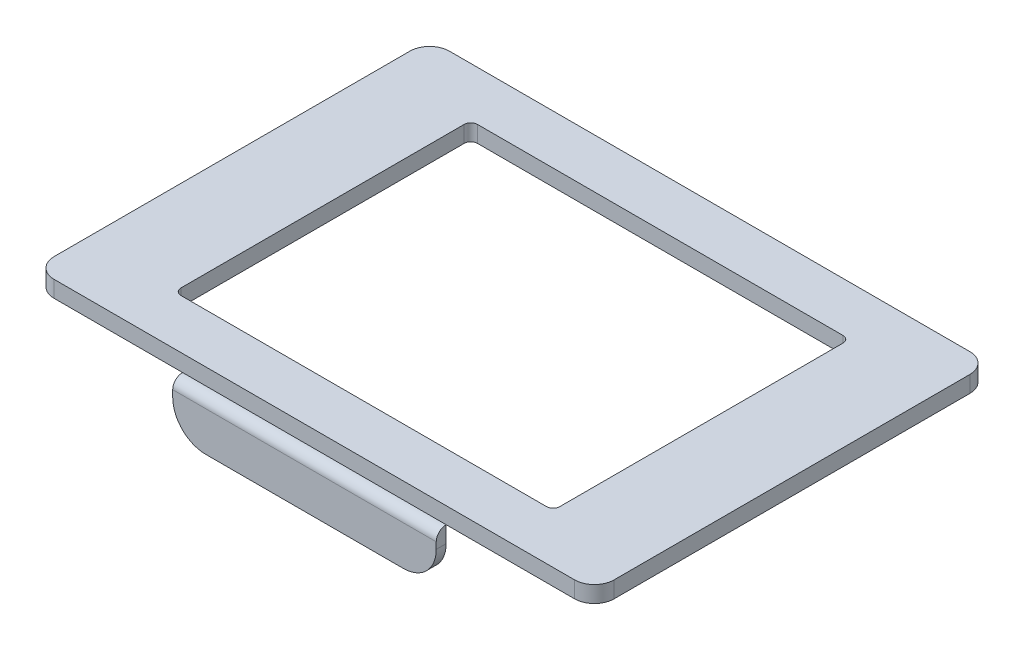
ISO-10303-21;
HEADER;
FILE_DESCRIPTION(('STEP AP214'),'2;1');
FILE_NAME('part.step','',(''),(''),'','','');
FILE_SCHEMA(('AUTOMOTIVE_DESIGN { 1 0 10303 214 1 1 1 1 }'));
ENDSEC;
DATA;
#1=APPLICATION_CONTEXT('core data for automotive mechanical design processes');
#2=APPLICATION_PROTOCOL_DEFINITION('international standard','automotive_design',2000,#1);
#3=PRODUCT_CONTEXT('',#1,'mechanical');
#4=PRODUCT('Part','Part','',(#3));
#5=PRODUCT_RELATED_PRODUCT_CATEGORY('part','',(#4));
#6=PRODUCT_DEFINITION_FORMATION('','',#4);
#7=PRODUCT_DEFINITION_CONTEXT('part definition',#1,'design');
#8=PRODUCT_DEFINITION('design','',#6,#7);
#9=PRODUCT_DEFINITION_SHAPE('','',#8);
#10=(LENGTH_UNIT() NAMED_UNIT(*) SI_UNIT(.MILLI.,.METRE.));
#11=(NAMED_UNIT(*) PLANE_ANGLE_UNIT() SI_UNIT($,.RADIAN.));
#12=(NAMED_UNIT(*) SI_UNIT($,.STERADIAN.) SOLID_ANGLE_UNIT());
#13=UNCERTAINTY_MEASURE_WITH_UNIT(LENGTH_MEASURE(1.E-05),#10,'distance_accuracy_value','');
#14=(GEOMETRIC_REPRESENTATION_CONTEXT(3) GLOBAL_UNCERTAINTY_ASSIGNED_CONTEXT((#13)) GLOBAL_UNIT_ASSIGNED_CONTEXT((#10,
#11,#12)) REPRESENTATION_CONTEXT('',''));
#15=CARTESIAN_POINT('',(0.,0.,0.));
#16=DIRECTION('',(0.,0.,1.));
#17=DIRECTION('',(1.,0.,0.));
#18=AXIS2_PLACEMENT_3D('',#15,#16,#17);
#19=CARTESIAN_POINT('',(40.,0.,-63.));
#20=DIRECTION('',(-1.,0.,0.));
#21=DIRECTION('',(0.,0.,1.));
#22=AXIS2_PLACEMENT_3D('',#19,#20,#21);
#23=PLANE('',#22);
#24=DIRECTION('',(0.,-1.,0.));
#25=VECTOR('',#24,1.);
#26=CARTESIAN_POINT('',(40.,0.,-60.));
#27=LINE('',#26,#25);
#28=CARTESIAN_POINT('',(40.,0.,-60.));
#29=VERTEX_POINT('',#28);
#30=CARTESIAN_POINT('',(40.,-5.,-60.));
#31=VERTEX_POINT('',#30);
#32=EDGE_CURVE('E119',#29,#31,#27,.T.);
#33=ORIENTED_EDGE('',*,*,#32,.T.);
#34=DIRECTION('',(0.,0.,1.));
#35=VECTOR('',#34,1.);
#36=CARTESIAN_POINT('',(40.,-5.,-63.));
#37=LINE('',#36,#35);
#38=CARTESIAN_POINT('',(40.,-5.,-63.));
#39=VERTEX_POINT('',#38);
#40=EDGE_CURVE('E71',#31,#39,#37,.F.);
#41=ORIENTED_EDGE('',*,*,#40,.T.);
#42=DIRECTION('',(0.,-1.,0.));
#43=VECTOR('',#42,1.);
#44=CARTESIAN_POINT('',(40.,0.,-63.));
#45=LINE('',#44,#43);
#46=CARTESIAN_POINT('',(40.,-3.,-63.));
#47=VERTEX_POINT('',#46);
#48=EDGE_CURVE('E121',#47,#39,#45,.T.);
#49=ORIENTED_EDGE('',*,*,#48,.F.);
#50=CARTESIAN_POINT('',(40.,-3.,-60.));
#51=DIRECTION('',(-1.,0.,0.));
#52=DIRECTION('',(0.,0.,1.));
#53=AXIS2_PLACEMENT_3D('',#50,#51,#52);
#54=CIRCLE('',#53,3.);
#55=EDGE_CURVE('E127',#47,#29,#54,.F.);
#56=ORIENTED_EDGE('',*,*,#55,.T.);
#57=EDGE_LOOP('',(#33,#41,#49,#56));
#58=FACE_BOUND('',#57,.T.);
#59=ADVANCED_FACE('F48',(#58),#23,.F.);
#60=CARTESIAN_POINT('',(40.,-15.,-63.));
#61=DIRECTION('',(0.,1.,0.));
#62=DIRECTION('',(0.,0.,1.));
#63=AXIS2_PLACEMENT_3D('',#60,#61,#62);
#64=PLANE('',#63);
#65=DIRECTION('',(-1.,0.,0.));
#66=VECTOR('',#65,1.);
#67=CARTESIAN_POINT('',(40.,-15.,-63.));
#68=LINE('',#67,#66);
#69=CARTESIAN_POINT('',(30.,-15.,-63.));
#70=VERTEX_POINT('',#69);
#71=CARTESIAN_POINT('',(-30.,-15.,-63.));
#72=VERTEX_POINT('',#71);
#73=EDGE_CURVE('E144',#70,#72,#68,.T.);
#74=ORIENTED_EDGE('',*,*,#73,.F.);
#75=DIRECTION('',(0.,0.,1.));
#76=VECTOR('',#75,1.);
#77=CARTESIAN_POINT('',(30.,-15.,-63.));
#78=LINE('',#77,#76);
#79=CARTESIAN_POINT('',(30.,-15.,-60.));
#80=VERTEX_POINT('',#79);
#81=EDGE_CURVE('E129',#70,#80,#78,.T.);
#82=ORIENTED_EDGE('',*,*,#81,.T.);
#83=DIRECTION('',(-1.,0.,0.));
#84=VECTOR('',#83,1.);
#85=CARTESIAN_POINT('',(40.,-15.,-60.));
#86=LINE('',#85,#84);
#87=CARTESIAN_POINT('',(-30.,-15.,-60.));
#88=VERTEX_POINT('',#87);
#89=EDGE_CURVE('E113',#80,#88,#86,.T.);
#90=ORIENTED_EDGE('',*,*,#89,.T.);
#91=DIRECTION('',(0.,0.,1.));
#92=VECTOR('',#91,1.);
#93=CARTESIAN_POINT('',(-30.,-15.,-63.));
#94=LINE('',#93,#92);
#95=EDGE_CURVE('E126',#88,#72,#94,.F.);
#96=ORIENTED_EDGE('',*,*,#95,.T.);
#97=EDGE_LOOP('',(#74,#82,#90,#96));
#98=FACE_BOUND('',#97,.T.);
#99=ADVANCED_FACE('F148',(#98),#64,.F.);
#100=CARTESIAN_POINT('',(-40.,0.,-63.));
#101=DIRECTION('',(1.,0.,0.));
#102=DIRECTION('',(0.,0.,-1.));
#103=AXIS2_PLACEMENT_3D('',#100,#101,#102);
#104=PLANE('',#103);
#105=DIRECTION('',(0.,1.,0.));
#106=VECTOR('',#105,1.);
#107=CARTESIAN_POINT('',(-40.,0.,-63.));
#108=LINE('',#107,#106);
#109=CARTESIAN_POINT('',(-40.,-5.,-63.));
#110=VERTEX_POINT('',#109);
#111=CARTESIAN_POINT('',(-40.,-3.,-63.));
#112=VERTEX_POINT('',#111);
#113=EDGE_CURVE('E151',#110,#112,#108,.T.);
#114=ORIENTED_EDGE('',*,*,#113,.F.);
#115=DIRECTION('',(0.,0.,1.));
#116=VECTOR('',#115,1.);
#117=CARTESIAN_POINT('',(-40.,-5.,-63.));
#118=LINE('',#117,#116);
#119=CARTESIAN_POINT('',(-40.,-5.,-60.));
#120=VERTEX_POINT('',#119);
#121=EDGE_CURVE('E12',#110,#120,#118,.T.);
#122=ORIENTED_EDGE('',*,*,#121,.T.);
#123=DIRECTION('',(0.,1.,0.));
#124=VECTOR('',#123,1.);
#125=CARTESIAN_POINT('',(-40.,0.,-60.));
#126=LINE('',#125,#124);
#127=CARTESIAN_POINT('',(-40.,0.,-60.));
#128=VERTEX_POINT('',#127);
#129=EDGE_CURVE('E104',#120,#128,#126,.T.);
#130=ORIENTED_EDGE('',*,*,#129,.T.);
#131=CARTESIAN_POINT('',(-40.,-3.,-60.));
#132=DIRECTION('',(1.,0.,0.));
#133=DIRECTION('',(0.,0.,-1.));
#134=AXIS2_PLACEMENT_3D('',#131,#132,#133);
#135=CIRCLE('',#134,3.);
#136=EDGE_CURVE('E108',#128,#112,#135,.F.);
#137=ORIENTED_EDGE('',*,*,#136,.T.);
#138=EDGE_LOOP('',(#114,#122,#130,#137));
#139=FACE_BOUND('',#138,.T.);
#140=ADVANCED_FACE('F106',(#139),#104,.F.);
#141=CARTESIAN_POINT('',(0.,0.,-63.));
#142=DIRECTION('',(0.,0.,-1.));
#143=DIRECTION('',(-1.,0.,0.));
#144=AXIS2_PLACEMENT_3D('',#141,#142,#143);
#145=PLANE('',#144);
#146=ORIENTED_EDGE('',*,*,#48,.T.);
#147=CARTESIAN_POINT('',(30.,-5.,-63.));
#148=DIRECTION('',(0.,0.,-1.));
#149=DIRECTION('',(-1.,0.,0.));
#150=AXIS2_PLACEMENT_3D('',#147,#148,#149);
#151=CIRCLE('',#150,10.);
#152=EDGE_CURVE('E56',#39,#70,#151,.T.);
#153=ORIENTED_EDGE('',*,*,#152,.T.);
#154=ORIENTED_EDGE('',*,*,#73,.T.);
#155=CARTESIAN_POINT('',(-30.,-5.,-63.));
#156=DIRECTION('',(0.,0.,-1.));
#157=DIRECTION('',(-1.,0.,0.));
#158=AXIS2_PLACEMENT_3D('',#155,#156,#157);
#159=CIRCLE('',#158,10.);
#160=EDGE_CURVE('E63',#72,#110,#159,.T.);
#161=ORIENTED_EDGE('',*,*,#160,.T.);
#162=ORIENTED_EDGE('',*,*,#113,.T.);
#163=DIRECTION('',(1.,0.,0.));
#164=VECTOR('',#163,1.);
#165=CARTESIAN_POINT('',(40.,-3.,-63.));
#166=LINE('',#165,#164);
#167=EDGE_CURVE('E125',#112,#47,#166,.T.);
#168=ORIENTED_EDGE('',*,*,#167,.T.);
#169=EDGE_LOOP('',(#146,#153,#154,#161,#162,#168));
#170=FACE_BOUND('',#169,.T.);
#171=ADVANCED_FACE('F143',(#170),#145,.T.);
#172=CARTESIAN_POINT('',(0.,0.,-60.));
#173=DIRECTION('',(0.,0.,-1.));
#174=DIRECTION('',(-1.,0.,0.));
#175=AXIS2_PLACEMENT_3D('',#172,#173,#174);
#176=PLANE('',#175);
#177=ORIENTED_EDGE('',*,*,#89,.F.);
#178=CARTESIAN_POINT('',(30.,-5.,-60.));
#179=DIRECTION('',(0.,0.,-1.));
#180=DIRECTION('',(-1.,0.,0.));
#181=AXIS2_PLACEMENT_3D('',#178,#179,#180);
#182=CIRCLE('',#181,10.);
#183=EDGE_CURVE('E138',#80,#31,#182,.F.);
#184=ORIENTED_EDGE('',*,*,#183,.T.);
#185=ORIENTED_EDGE('',*,*,#32,.F.);
#186=DIRECTION('',(1.,0.,0.));
#187=VECTOR('',#186,1.);
#188=CARTESIAN_POINT('',(40.,0.,-60.));
#189=LINE('',#188,#187);
#190=EDGE_CURVE('E112',#128,#29,#189,.T.);
#191=ORIENTED_EDGE('',*,*,#190,.F.);
#192=ORIENTED_EDGE('',*,*,#129,.F.);
#193=CARTESIAN_POINT('',(-30.,-5.,-60.));
#194=DIRECTION('',(0.,0.,-1.));
#195=DIRECTION('',(-1.,0.,0.));
#196=AXIS2_PLACEMENT_3D('',#193,#194,#195);
#197=CIRCLE('',#196,10.);
#198=EDGE_CURVE('E136',#120,#88,#197,.F.);
#199=ORIENTED_EDGE('',*,*,#198,.T.);
#200=EDGE_LOOP('',(#177,#184,#185,#191,#192,#199));
#201=FACE_BOUND('',#200,.T.);
#202=ADVANCED_FACE('F118',(#201),#176,.F.);
#203=CARTESIAN_POINT('',(0.,-3.,-60.));
#204=DIRECTION('',(-1.,0.,0.));
#205=DIRECTION('',(0.,-1.,0.));
#206=AXIS2_PLACEMENT_3D('',#203,#204,#205);
#207=CYLINDRICAL_SURFACE('',#206,3.);
#208=ORIENTED_EDGE('',*,*,#136,.F.);
#209=ORIENTED_EDGE('',*,*,#190,.T.);
#210=ORIENTED_EDGE('',*,*,#55,.F.);
#211=ORIENTED_EDGE('',*,*,#167,.F.);
#212=EDGE_LOOP('',(#208,#209,#210,#211));
#213=FACE_BOUND('',#212,.T.);
#214=ADVANCED_FACE('F123',(#213),#207,.T.);
#215=CARTESIAN_POINT('',(30.,-5.,-63.));
#216=DIRECTION('',(0.,0.,1.));
#217=DIRECTION('',(1.,0.,0.));
#218=AXIS2_PLACEMENT_3D('',#215,#216,#217);
#219=CYLINDRICAL_SURFACE('',#218,10.);
#220=ORIENTED_EDGE('',*,*,#152,.F.);
#221=ORIENTED_EDGE('',*,*,#40,.F.);
#222=ORIENTED_EDGE('',*,*,#183,.F.);
#223=ORIENTED_EDGE('',*,*,#81,.F.);
#224=EDGE_LOOP('',(#220,#221,#222,#223));
#225=FACE_BOUND('',#224,.T.);
#226=ADVANCED_FACE('F153',(#225),#219,.T.);
#227=CARTESIAN_POINT('',(-30.,-5.,-63.));
#228=DIRECTION('',(0.,0.,1.));
#229=DIRECTION('',(1.,0.,0.));
#230=AXIS2_PLACEMENT_3D('',#227,#228,#229);
#231=CYLINDRICAL_SURFACE('',#230,10.);
#232=ORIENTED_EDGE('',*,*,#160,.F.);
#233=ORIENTED_EDGE('',*,*,#95,.F.);
#234=ORIENTED_EDGE('',*,*,#198,.F.);
#235=ORIENTED_EDGE('',*,*,#121,.F.);
#236=EDGE_LOOP('',(#232,#233,#234,#235));
#237=FACE_BOUND('',#236,.T.);
#238=ADVANCED_FACE('F50',(#237),#231,.T.);
#239=CLOSED_SHELL('',(#59,#99,#140,#171,#202,#214,#226,#238));
#240=MANIFOLD_SOLID_BREP('B2',#239);
#241=CARTESIAN_POINT('',(-40.,0.,63.));
#242=DIRECTION('',(1.,0.,0.));
#243=DIRECTION('',(0.,1.,0.));
#244=AXIS2_PLACEMENT_3D('',#241,#242,#243);
#245=PLANE('',#244);
#246=DIRECTION('',(0.,-1.,0.));
#247=VECTOR('',#246,1.);
#248=CARTESIAN_POINT('',(-40.,0.,63.));
#249=LINE('',#248,#247);
#250=CARTESIAN_POINT('',(-40.,-3.00000000000001,63.));
#251=VERTEX_POINT('',#250);
#252=CARTESIAN_POINT('',(-40.,-5.,63.));
#253=VERTEX_POINT('',#252);
#254=EDGE_CURVE('E297',#251,#253,#249,.T.);
#255=ORIENTED_EDGE('',*,*,#254,.F.);
#256=CARTESIAN_POINT('',(-40.,-3.00000000000001,60.));
#257=DIRECTION('',(1.,0.,0.));
#258=DIRECTION('',(0.,1.,0.));
#259=AXIS2_PLACEMENT_3D('',#256,#257,#258);
#260=CIRCLE('',#259,3.);
#261=CARTESIAN_POINT('',(-40.,0.,60.));
#262=VERTEX_POINT('',#261);
#263=EDGE_CURVE('E241',#251,#262,#260,.F.);
#264=ORIENTED_EDGE('',*,*,#263,.T.);
#265=DIRECTION('',(0.,-1.,0.));
#266=VECTOR('',#265,1.);
#267=CARTESIAN_POINT('',(-40.,0.,60.));
#268=LINE('',#267,#266);
#269=CARTESIAN_POINT('',(-40.,-5.,60.));
#270=VERTEX_POINT('',#269);
#271=EDGE_CURVE('E296',#262,#270,#268,.T.);
#272=ORIENTED_EDGE('',*,*,#271,.T.);
#273=DIRECTION('',(0.,0.,-1.));
#274=VECTOR('',#273,1.);
#275=CARTESIAN_POINT('',(-40.,-5.,63.));
#276=LINE('',#275,#274);
#277=EDGE_CURVE('E302',#270,#253,#276,.F.);
#278=ORIENTED_EDGE('',*,*,#277,.T.);
#279=EDGE_LOOP('',(#255,#264,#272,#278));
#280=FACE_BOUND('',#279,.T.);
#281=ADVANCED_FACE('F233',(#280),#245,.F.);
#282=CARTESIAN_POINT('',(-40.,-15.,63.));
#283=DIRECTION('',(0.,1.,0.));
#284=DIRECTION('',(-1.,0.,0.));
#285=AXIS2_PLACEMENT_3D('',#282,#283,#284);
#286=PLANE('',#285);
#287=DIRECTION('',(1.,0.,0.));
#288=VECTOR('',#287,1.);
#289=CARTESIAN_POINT('',(-40.,-15.,60.));
#290=LINE('',#289,#288);
#291=CARTESIAN_POINT('',(-30.,-15.,60.));
#292=VERTEX_POINT('',#291);
#293=CARTESIAN_POINT('',(30.,-15.,60.));
#294=VERTEX_POINT('',#293);
#295=EDGE_CURVE('E291',#292,#294,#290,.T.);
#296=ORIENTED_EDGE('',*,*,#295,.T.);
#297=DIRECTION('',(0.,0.,-1.));
#298=VECTOR('',#297,1.);
#299=CARTESIAN_POINT('',(30.,-15.,63.));
#300=LINE('',#299,#298);
#301=CARTESIAN_POINT('',(30.,-15.,63.));
#302=VERTEX_POINT('',#301);
#303=EDGE_CURVE('E311',#294,#302,#300,.F.);
#304=ORIENTED_EDGE('',*,*,#303,.T.);
#305=DIRECTION('',(1.,0.,0.));
#306=VECTOR('',#305,1.);
#307=CARTESIAN_POINT('',(-40.,-15.,63.));
#308=LINE('',#307,#306);
#309=CARTESIAN_POINT('',(-30.,-15.,63.));
#310=VERTEX_POINT('',#309);
#311=EDGE_CURVE('E326',#310,#302,#308,.T.);
#312=ORIENTED_EDGE('',*,*,#311,.F.);
#313=DIRECTION('',(0.,0.,-1.));
#314=VECTOR('',#313,1.);
#315=CARTESIAN_POINT('',(-30.,-15.,63.));
#316=LINE('',#315,#314);
#317=EDGE_CURVE('E313',#310,#292,#316,.T.);
#318=ORIENTED_EDGE('',*,*,#317,.T.);
#319=EDGE_LOOP('',(#296,#304,#312,#318));
#320=FACE_BOUND('',#319,.T.);
#321=ADVANCED_FACE('F339',(#320),#286,.F.);
#322=CARTESIAN_POINT('',(40.,0.,63.));
#323=DIRECTION('',(-1.,0.,0.));
#324=DIRECTION('',(0.,0.,1.));
#325=AXIS2_PLACEMENT_3D('',#322,#323,#324);
#326=PLANE('',#325);
#327=DIRECTION('',(0.,1.,0.));
#328=VECTOR('',#327,1.);
#329=CARTESIAN_POINT('',(40.,0.,60.));
#330=LINE('',#329,#328);
#331=CARTESIAN_POINT('',(40.,-5.,60.));
#332=VERTEX_POINT('',#331);
#333=CARTESIAN_POINT('',(40.,0.,60.));
#334=VERTEX_POINT('',#333);
#335=EDGE_CURVE('E284',#332,#334,#330,.T.);
#336=ORIENTED_EDGE('',*,*,#335,.T.);
#337=CARTESIAN_POINT('',(40.,-3.,60.));
#338=DIRECTION('',(-1.,0.,0.));
#339=DIRECTION('',(0.,0.,1.));
#340=AXIS2_PLACEMENT_3D('',#337,#338,#339);
#341=CIRCLE('',#340,3.);
#342=CARTESIAN_POINT('',(40.,-3.,63.));
#343=VERTEX_POINT('',#342);
#344=EDGE_CURVE('E46',#334,#343,#341,.F.);
#345=ORIENTED_EDGE('',*,*,#344,.T.);
#346=DIRECTION('',(0.,1.,0.));
#347=VECTOR('',#346,1.);
#348=CARTESIAN_POINT('',(40.,0.,63.));
#349=LINE('',#348,#347);
#350=CARTESIAN_POINT('',(40.,-5.,63.));
#351=VERTEX_POINT('',#350);
#352=EDGE_CURVE('E320',#351,#343,#349,.T.);
#353=ORIENTED_EDGE('',*,*,#352,.F.);
#354=DIRECTION('',(0.,0.,-1.));
#355=VECTOR('',#354,1.);
#356=CARTESIAN_POINT('',(40.,-5.,63.));
#357=LINE('',#356,#355);
#358=EDGE_CURVE('E288',#351,#332,#357,.T.);
#359=ORIENTED_EDGE('',*,*,#358,.T.);
#360=EDGE_LOOP('',(#336,#345,#353,#359));
#361=FACE_BOUND('',#360,.T.);
#362=ADVANCED_FACE('F286',(#361),#326,.F.);
#363=CARTESIAN_POINT('',(0.,0.,63.));
#364=DIRECTION('',(0.,0.,1.));
#365=DIRECTION('',(1.,0.,0.));
#366=AXIS2_PLACEMENT_3D('',#363,#364,#365);
#367=PLANE('',#366);
#368=ORIENTED_EDGE('',*,*,#352,.T.);
#369=DIRECTION('',(-1.,0.,0.));
#370=VECTOR('',#369,1.);
#371=CARTESIAN_POINT('',(-40.,-3.00000000000001,63.));
#372=LINE('',#371,#370);
#373=EDGE_CURVE('E299',#343,#251,#372,.T.);
#374=ORIENTED_EDGE('',*,*,#373,.T.);
#375=ORIENTED_EDGE('',*,*,#254,.T.);
#376=CARTESIAN_POINT('',(-30.,-5.00000000000001,63.));
#377=DIRECTION('',(0.,0.,1.));
#378=DIRECTION('',(1.,0.,0.));
#379=AXIS2_PLACEMENT_3D('',#376,#377,#378);
#380=CIRCLE('',#379,10.);
#381=EDGE_CURVE('E309',#253,#310,#380,.T.);
#382=ORIENTED_EDGE('',*,*,#381,.T.);
#383=ORIENTED_EDGE('',*,*,#311,.T.);
#384=CARTESIAN_POINT('',(30.,-5.,63.));
#385=DIRECTION('',(0.,0.,1.));
#386=DIRECTION('',(1.,0.,0.));
#387=AXIS2_PLACEMENT_3D('',#384,#385,#386);
#388=CIRCLE('',#387,10.);
#389=EDGE_CURVE('E305',#302,#351,#388,.T.);
#390=ORIENTED_EDGE('',*,*,#389,.T.);
#391=EDGE_LOOP('',(#368,#374,#375,#382,#383,#390));
#392=FACE_BOUND('',#391,.T.);
#393=ADVANCED_FACE('F329',(#392),#367,.T.);
#394=CARTESIAN_POINT('',(0.,0.,60.));
#395=DIRECTION('',(0.,0.,1.));
#396=DIRECTION('',(1.,0.,0.));
#397=AXIS2_PLACEMENT_3D('',#394,#395,#396);
#398=PLANE('',#397);
#399=ORIENTED_EDGE('',*,*,#335,.F.);
#400=CARTESIAN_POINT('',(30.,-5.,60.));
#401=DIRECTION('',(0.,0.,1.));
#402=DIRECTION('',(1.,0.,0.));
#403=AXIS2_PLACEMENT_3D('',#400,#401,#402);
#404=CIRCLE('',#403,10.);
#405=EDGE_CURVE('E316',#332,#294,#404,.F.);
#406=ORIENTED_EDGE('',*,*,#405,.T.);
#407=ORIENTED_EDGE('',*,*,#295,.F.);
#408=CARTESIAN_POINT('',(-30.,-5.00000000000001,60.));
#409=DIRECTION('',(0.,0.,1.));
#410=DIRECTION('',(1.,0.,0.));
#411=AXIS2_PLACEMENT_3D('',#408,#409,#410);
#412=CIRCLE('',#411,10.);
#413=EDGE_CURVE('E318',#292,#270,#412,.F.);
#414=ORIENTED_EDGE('',*,*,#413,.T.);
#415=ORIENTED_EDGE('',*,*,#271,.F.);
#416=DIRECTION('',(-1.,0.,0.));
#417=VECTOR('',#416,1.);
#418=CARTESIAN_POINT('',(-40.,0.,60.));
#419=LINE('',#418,#417);
#420=EDGE_CURVE('E290',#334,#262,#419,.T.);
#421=ORIENTED_EDGE('',*,*,#420,.F.);
#422=EDGE_LOOP('',(#399,#406,#407,#414,#415,#421));
#423=FACE_BOUND('',#422,.T.);
#424=ADVANCED_FACE('F294',(#423),#398,.F.);
#425=CARTESIAN_POINT('',(30.,-5.,63.));
#426=DIRECTION('',(0.,0.,-1.));
#427=DIRECTION('',(-1.,0.,0.));
#428=AXIS2_PLACEMENT_3D('',#425,#426,#427);
#429=CYLINDRICAL_SURFACE('',#428,10.);
#430=ORIENTED_EDGE('',*,*,#389,.F.);
#431=ORIENTED_EDGE('',*,*,#303,.F.);
#432=ORIENTED_EDGE('',*,*,#405,.F.);
#433=ORIENTED_EDGE('',*,*,#358,.F.);
#434=EDGE_LOOP('',(#430,#431,#432,#433));
#435=FACE_BOUND('',#434,.T.);
#436=ADVANCED_FACE('F343',(#435),#429,.T.);
#437=CARTESIAN_POINT('',(-30.,-5.00000000000001,63.));
#438=DIRECTION('',(0.,0.,-1.));
#439=DIRECTION('',(-1.,0.,0.));
#440=AXIS2_PLACEMENT_3D('',#437,#438,#439);
#441=CYLINDRICAL_SURFACE('',#440,10.);
#442=ORIENTED_EDGE('',*,*,#381,.F.);
#443=ORIENTED_EDGE('',*,*,#277,.F.);
#444=ORIENTED_EDGE('',*,*,#413,.F.);
#445=ORIENTED_EDGE('',*,*,#317,.F.);
#446=EDGE_LOOP('',(#442,#443,#444,#445));
#447=FACE_BOUND('',#446,.T.);
#448=ADVANCED_FACE('F336',(#447),#441,.T.);
#449=CARTESIAN_POINT('',(0.,-3.00000000000001,60.));
#450=DIRECTION('',(1.,0.,0.));
#451=DIRECTION('',(0.,1.,0.));
#452=AXIS2_PLACEMENT_3D('',#449,#450,#451);
#453=CYLINDRICAL_SURFACE('',#452,3.);
#454=ORIENTED_EDGE('',*,*,#344,.F.);
#455=ORIENTED_EDGE('',*,*,#420,.T.);
#456=ORIENTED_EDGE('',*,*,#263,.F.);
#457=ORIENTED_EDGE('',*,*,#373,.F.);
#458=EDGE_LOOP('',(#454,#455,#456,#457));
#459=FACE_BOUND('',#458,.T.);
#460=ADVANCED_FACE('F235',(#459),#453,.T.);
#461=CLOSED_SHELL('',(#281,#321,#362,#393,#424,#436,#448,#460));
#462=MANIFOLD_SOLID_BREP('B6',#461);
#463=CARTESIAN_POINT('',(85.,5.,-60.));
#464=DIRECTION('',(-1.,0.,0.));
#465=DIRECTION('',(0.,0.,1.));
#466=AXIS2_PLACEMENT_3D('',#463,#464,#465);
#467=PLANE('',#466);
#468=DIRECTION('',(0.,0.,-1.));
#469=VECTOR('',#468,1.);
#470=CARTESIAN_POINT('',(85.,0.,-60.));
#471=LINE('',#470,#469);
#472=CARTESIAN_POINT('',(85.,0.,54.));
#473=VERTEX_POINT('',#472);
#474=CARTESIAN_POINT('',(85.,0.,-54.));
#475=VERTEX_POINT('',#474);
#476=EDGE_CURVE('E550',#473,#475,#471,.T.);
#477=ORIENTED_EDGE('',*,*,#476,.T.);
#478=DIRECTION('',(0.,-1.,0.));
#479=VECTOR('',#478,1.);
#480=CARTESIAN_POINT('',(85.,5.,-54.));
#481=LINE('',#480,#479);
#482=CARTESIAN_POINT('',(85.,5.,-54.));
#483=VERTEX_POINT('',#482);
#484=EDGE_CURVE('E528',#475,#483,#481,.F.);
#485=ORIENTED_EDGE('',*,*,#484,.T.);
#486=DIRECTION('',(0.,0.,-1.));
#487=VECTOR('',#486,1.);
#488=CARTESIAN_POINT('',(85.,5.,-60.));
#489=LINE('',#488,#487);
#490=CARTESIAN_POINT('',(85.,5.,54.));
#491=VERTEX_POINT('',#490);
#492=EDGE_CURVE('E561',#491,#483,#489,.T.);
#493=ORIENTED_EDGE('',*,*,#492,.F.);
#494=DIRECTION('',(0.,-1.,0.));
#495=VECTOR('',#494,1.);
#496=CARTESIAN_POINT('',(85.,5.,54.));
#497=LINE('',#496,#495);
#498=EDGE_CURVE('E533',#491,#473,#497,.T.);
#499=ORIENTED_EDGE('',*,*,#498,.T.);
#500=EDGE_LOOP('',(#477,#485,#493,#499));
#501=FACE_BOUND('',#500,.T.);
#502=ADVANCED_FACE('F409',(#501),#467,.F.);
#503=CARTESIAN_POINT('',(-85.,5.,-60.));
#504=DIRECTION('',(0.,0.,1.));
#505=DIRECTION('',(1.,0.,0.));
#506=AXIS2_PLACEMENT_3D('',#503,#504,#505);
#507=PLANE('',#506);
#508=DIRECTION('',(-1.,0.,0.));
#509=VECTOR('',#508,1.);
#510=CARTESIAN_POINT('',(-85.,5.,-60.));
#511=LINE('',#510,#509);
#512=CARTESIAN_POINT('',(79.,5.,-60.));
#513=VERTEX_POINT('',#512);
#514=CARTESIAN_POINT('',(-79.,5.,-60.));
#515=VERTEX_POINT('',#514);
#516=EDGE_CURVE('E542',#513,#515,#511,.T.);
#517=ORIENTED_EDGE('',*,*,#516,.F.);
#518=DIRECTION('',(0.,-1.,0.));
#519=VECTOR('',#518,1.);
#520=CARTESIAN_POINT('',(79.,5.,-60.));
#521=LINE('',#520,#519);
#522=CARTESIAN_POINT('',(79.,0.,-60.));
#523=VERTEX_POINT('',#522);
#524=EDGE_CURVE('E527',#513,#523,#521,.T.);
#525=ORIENTED_EDGE('',*,*,#524,.T.);
#526=DIRECTION('',(-1.,0.,0.));
#527=VECTOR('',#526,1.);
#528=CARTESIAN_POINT('',(-85.,0.,-60.));
#529=LINE('',#528,#527);
#530=CARTESIAN_POINT('',(-79.,0.,-60.));
#531=VERTEX_POINT('',#530);
#532=EDGE_CURVE('E539',#523,#531,#529,.T.);
#533=ORIENTED_EDGE('',*,*,#532,.T.);
#534=DIRECTION('',(0.,-1.,0.));
#535=VECTOR('',#534,1.);
#536=CARTESIAN_POINT('',(-79.,5.,-60.));
#537=LINE('',#536,#535);
#538=EDGE_CURVE('E544',#531,#515,#537,.F.);
#539=ORIENTED_EDGE('',*,*,#538,.T.);
#540=EDGE_LOOP('',(#517,#525,#533,#539));
#541=FACE_BOUND('',#540,.T.);
#542=ADVANCED_FACE('F538',(#541),#507,.F.);
#543=CARTESIAN_POINT('',(-85.,5.,-60.));
#544=DIRECTION('',(1.,0.,0.));
#545=DIRECTION('',(0.,0.,-1.));
#546=AXIS2_PLACEMENT_3D('',#543,#544,#545);
#547=PLANE('',#546);
#548=DIRECTION('',(0.,0.,1.));
#549=VECTOR('',#548,1.);
#550=CARTESIAN_POINT('',(-85.,5.,-60.));
#551=LINE('',#550,#549);
#552=CARTESIAN_POINT('',(-85.,5.,-54.));
#553=VERTEX_POINT('',#552);
#554=CARTESIAN_POINT('',(-85.,5.,54.));
#555=VERTEX_POINT('',#554);
#556=EDGE_CURVE('E676',#553,#555,#551,.T.);
#557=ORIENTED_EDGE('',*,*,#556,.F.);
#558=DIRECTION('',(0.,-1.,0.));
#559=VECTOR('',#558,1.);
#560=CARTESIAN_POINT('',(-85.,5.,-54.));
#561=LINE('',#560,#559);
#562=CARTESIAN_POINT('',(-85.,0.,-54.));
#563=VERTEX_POINT('',#562);
#564=EDGE_CURVE('E581',#553,#563,#561,.T.);
#565=ORIENTED_EDGE('',*,*,#564,.T.);
#566=DIRECTION('',(0.,0.,1.));
#567=VECTOR('',#566,1.);
#568=CARTESIAN_POINT('',(-85.,0.,-60.));
#569=LINE('',#568,#567);
#570=CARTESIAN_POINT('',(-85.,0.,54.));
#571=VERTEX_POINT('',#570);
#572=EDGE_CURVE('E549',#563,#571,#569,.T.);
#573=ORIENTED_EDGE('',*,*,#572,.T.);
#574=DIRECTION('',(0.,-1.,0.));
#575=VECTOR('',#574,1.);
#576=CARTESIAN_POINT('',(-85.,5.,54.));
#577=LINE('',#576,#575);
#578=EDGE_CURVE('E579',#571,#555,#577,.F.);
#579=ORIENTED_EDGE('',*,*,#578,.T.);
#580=EDGE_LOOP('',(#557,#565,#573,#579));
#581=FACE_BOUND('',#580,.T.);
#582=ADVANCED_FACE('F697',(#581),#547,.F.);
#583=CARTESIAN_POINT('',(-85.,5.,60.));
#584=DIRECTION('',(0.,0.,-1.));
#585=DIRECTION('',(-1.,0.,0.));
#586=AXIS2_PLACEMENT_3D('',#583,#584,#585);
#587=PLANE('',#586);
#588=DIRECTION('',(1.,0.,0.));
#589=VECTOR('',#588,1.);
#590=CARTESIAN_POINT('',(-85.,5.,60.));
#591=LINE('',#590,#589);
#592=CARTESIAN_POINT('',(-79.,5.,60.));
#593=VERTEX_POINT('',#592);
#594=CARTESIAN_POINT('',(79.,5.,60.));
#595=VERTEX_POINT('',#594);
#596=EDGE_CURVE('E562',#593,#595,#591,.T.);
#597=ORIENTED_EDGE('',*,*,#596,.F.);
#598=DIRECTION('',(0.,-1.,0.));
#599=VECTOR('',#598,1.);
#600=CARTESIAN_POINT('',(-79.,5.,60.));
#601=LINE('',#600,#599);
#602=CARTESIAN_POINT('',(-79.,0.,60.));
#603=VERTEX_POINT('',#602);
#604=EDGE_CURVE('E586',#593,#603,#601,.T.);
#605=ORIENTED_EDGE('',*,*,#604,.T.);
#606=DIRECTION('',(1.,0.,0.));
#607=VECTOR('',#606,1.);
#608=CARTESIAN_POINT('',(-85.,0.,60.));
#609=LINE('',#608,#607);
#610=CARTESIAN_POINT('',(79.,0.,60.));
#611=VERTEX_POINT('',#610);
#612=EDGE_CURVE('E553',#603,#611,#609,.T.);
#613=ORIENTED_EDGE('',*,*,#612,.T.);
#614=DIRECTION('',(0.,-1.,0.));
#615=VECTOR('',#614,1.);
#616=CARTESIAN_POINT('',(79.,5.,60.));
#617=LINE('',#616,#615);
#618=EDGE_CURVE('E584',#611,#595,#617,.F.);
#619=ORIENTED_EDGE('',*,*,#618,.T.);
#620=EDGE_LOOP('',(#597,#605,#613,#619));
#621=FACE_BOUND('',#620,.T.);
#622=ADVANCED_FACE('F691',(#621),#587,.F.);
#623=CARTESIAN_POINT('',(0.,5.,0.));
#624=DIRECTION('',(0.,1.,0.));
#625=DIRECTION('',(0.,0.,1.));
#626=AXIS2_PLACEMENT_3D('',#623,#624,#625);
#627=PLANE('',#626);
#628=DIRECTION('',(0.,0.,-1.));
#629=VECTOR('',#628,1.);
#630=CARTESIAN_POINT('',(57.5,5.,-45.));
#631=LINE('',#630,#629);
#632=CARTESIAN_POINT('',(57.5,5.,43.));
#633=VERTEX_POINT('',#632);
#634=CARTESIAN_POINT('',(57.5,5.,-43.));
#635=VERTEX_POINT('',#634);
#636=EDGE_CURVE('E641',#633,#635,#631,.T.);
#637=ORIENTED_EDGE('',*,*,#636,.F.);
#638=CARTESIAN_POINT('',(55.5,5.,43.));
#639=DIRECTION('',(0.,1.,0.));
#640=DIRECTION('',(0.,0.,1.));
#641=AXIS2_PLACEMENT_3D('',#638,#639,#640);
#642=CIRCLE('',#641,2.);
#643=CARTESIAN_POINT('',(55.5,5.,45.));
#644=VERTEX_POINT('',#643);
#645=EDGE_CURVE('E622',#633,#644,#642,.F.);
#646=ORIENTED_EDGE('',*,*,#645,.T.);
#647=DIRECTION('',(1.,0.,0.));
#648=VECTOR('',#647,1.);
#649=CARTESIAN_POINT('',(-57.5,5.,45.));
#650=LINE('',#649,#648);
#651=CARTESIAN_POINT('',(-55.5,5.,45.));
#652=VERTEX_POINT('',#651);
#653=EDGE_CURVE('E555',#652,#644,#650,.T.);
#654=ORIENTED_EDGE('',*,*,#653,.F.);
#655=CARTESIAN_POINT('',(-55.5,5.,43.));
#656=DIRECTION('',(0.,1.,0.));
#657=DIRECTION('',(0.,0.,1.));
#658=AXIS2_PLACEMENT_3D('',#655,#656,#657);
#659=CIRCLE('',#658,2.);
#660=CARTESIAN_POINT('',(-57.5,5.,43.));
#661=VERTEX_POINT('',#660);
#662=EDGE_CURVE('E618',#652,#661,#659,.F.);
#663=ORIENTED_EDGE('',*,*,#662,.T.);
#664=DIRECTION('',(0.,0.,1.));
#665=VECTOR('',#664,1.);
#666=CARTESIAN_POINT('',(-57.5,5.,-45.));
#667=LINE('',#666,#665);
#668=CARTESIAN_POINT('',(-57.5,5.,-43.));
#669=VERTEX_POINT('',#668);
#670=EDGE_CURVE('E636',#669,#661,#667,.T.);
#671=ORIENTED_EDGE('',*,*,#670,.F.);
#672=CARTESIAN_POINT('',(-55.5,5.,-43.));
#673=DIRECTION('',(0.,1.,0.));
#674=DIRECTION('',(0.,0.,1.));
#675=AXIS2_PLACEMENT_3D('',#672,#673,#674);
#676=CIRCLE('',#675,2.);
#677=CARTESIAN_POINT('',(-55.5,5.,-45.));
#678=VERTEX_POINT('',#677);
#679=EDGE_CURVE('E417',#669,#678,#676,.F.);
#680=ORIENTED_EDGE('',*,*,#679,.T.);
#681=DIRECTION('',(-1.,0.,0.));
#682=VECTOR('',#681,1.);
#683=CARTESIAN_POINT('',(-57.5,5.,-45.));
#684=LINE('',#683,#682);
#685=CARTESIAN_POINT('',(55.5,5.,-45.));
#686=VERTEX_POINT('',#685);
#687=EDGE_CURVE('E634',#686,#678,#684,.T.);
#688=ORIENTED_EDGE('',*,*,#687,.F.);
#689=CARTESIAN_POINT('',(55.5,5.,-43.));
#690=DIRECTION('',(0.,1.,0.));
#691=DIRECTION('',(0.,0.,1.));
#692=AXIS2_PLACEMENT_3D('',#689,#690,#691);
#693=CIRCLE('',#692,2.);
#694=EDGE_CURVE('E626',#686,#635,#693,.F.);
#695=ORIENTED_EDGE('',*,*,#694,.T.);
#696=EDGE_LOOP('',(#637,#646,#654,#663,#671,#680,#688,#695));
#697=FACE_BOUND('',#696,.T.);
#698=ORIENTED_EDGE('',*,*,#492,.T.);
#699=CARTESIAN_POINT('',(79.,5.,-54.));
#700=DIRECTION('',(0.,1.,0.));
#701=DIRECTION('',(0.,0.,1.));
#702=AXIS2_PLACEMENT_3D('',#699,#700,#701);
#703=CIRCLE('',#702,6.);
#704=EDGE_CURVE('E577',#483,#513,#703,.T.);
#705=ORIENTED_EDGE('',*,*,#704,.T.);
#706=ORIENTED_EDGE('',*,*,#516,.T.);
#707=CARTESIAN_POINT('',(-79.,5.,-54.));
#708=DIRECTION('',(0.,1.,0.));
#709=DIRECTION('',(0.,0.,1.));
#710=AXIS2_PLACEMENT_3D('',#707,#708,#709);
#711=CIRCLE('',#710,6.);
#712=EDGE_CURVE('E575',#515,#553,#711,.T.);
#713=ORIENTED_EDGE('',*,*,#712,.T.);
#714=ORIENTED_EDGE('',*,*,#556,.T.);
#715=CARTESIAN_POINT('',(-79.,5.,54.));
#716=DIRECTION('',(0.,1.,0.));
#717=DIRECTION('',(0.,0.,1.));
#718=AXIS2_PLACEMENT_3D('',#715,#716,#717);
#719=CIRCLE('',#718,6.);
#720=EDGE_CURVE('E573',#555,#593,#719,.T.);
#721=ORIENTED_EDGE('',*,*,#720,.T.);
#722=ORIENTED_EDGE('',*,*,#596,.T.);
#723=CARTESIAN_POINT('',(79.,5.,54.));
#724=DIRECTION('',(0.,1.,0.));
#725=DIRECTION('',(0.,0.,1.));
#726=AXIS2_PLACEMENT_3D('',#723,#724,#725);
#727=CIRCLE('',#726,6.);
#728=EDGE_CURVE('E571',#595,#491,#727,.T.);
#729=ORIENTED_EDGE('',*,*,#728,.T.);
#730=EDGE_LOOP('',(#698,#705,#706,#713,#714,#721,#722,#729));
#731=FACE_BOUND('',#730,.T.);
#732=ADVANCED_FACE('F632',(#697,#731),#627,.T.);
#733=CARTESIAN_POINT('',(0.,0.,0.));
#734=DIRECTION('',(0.,1.,0.));
#735=DIRECTION('',(0.,0.,1.));
#736=AXIS2_PLACEMENT_3D('',#733,#734,#735);
#737=PLANE('',#736);
#738=DIRECTION('',(0.,0.,1.));
#739=VECTOR('',#738,1.);
#740=CARTESIAN_POINT('',(-57.5,0.,0.));
#741=LINE('',#740,#739);
#742=CARTESIAN_POINT('',(-57.5,0.,-43.));
#743=VERTEX_POINT('',#742);
#744=CARTESIAN_POINT('',(-57.5,0.,43.));
#745=VERTEX_POINT('',#744);
#746=EDGE_CURVE('E591',#743,#745,#741,.T.);
#747=ORIENTED_EDGE('',*,*,#746,.T.);
#748=CARTESIAN_POINT('',(-55.5,0.,43.));
#749=DIRECTION('',(0.,1.,0.));
#750=DIRECTION('',(0.,0.,1.));
#751=AXIS2_PLACEMENT_3D('',#748,#749,#750);
#752=CIRCLE('',#751,2.);
#753=CARTESIAN_POINT('',(-55.5,0.,45.));
#754=VERTEX_POINT('',#753);
#755=EDGE_CURVE('E620',#745,#754,#752,.T.);
#756=ORIENTED_EDGE('',*,*,#755,.T.);
#757=DIRECTION('',(1.,0.,0.));
#758=VECTOR('',#757,1.);
#759=CARTESIAN_POINT('',(0.,0.,45.));
#760=LINE('',#759,#758);
#761=CARTESIAN_POINT('',(55.5,0.,45.));
#762=VERTEX_POINT('',#761);
#763=EDGE_CURVE('E594',#754,#762,#760,.T.);
#764=ORIENTED_EDGE('',*,*,#763,.T.);
#765=CARTESIAN_POINT('',(55.5,0.,43.));
#766=DIRECTION('',(0.,1.,0.));
#767=DIRECTION('',(0.,0.,1.));
#768=AXIS2_PLACEMENT_3D('',#765,#766,#767);
#769=CIRCLE('',#768,2.);
#770=CARTESIAN_POINT('',(57.5,0.,43.));
#771=VERTEX_POINT('',#770);
#772=EDGE_CURVE('E624',#762,#771,#769,.T.);
#773=ORIENTED_EDGE('',*,*,#772,.T.);
#774=DIRECTION('',(0.,0.,-1.));
#775=VECTOR('',#774,1.);
#776=CARTESIAN_POINT('',(57.5,0.,0.));
#777=LINE('',#776,#775);
#778=CARTESIAN_POINT('',(57.5,0.,-43.));
#779=VERTEX_POINT('',#778);
#780=EDGE_CURVE('E597',#771,#779,#777,.T.);
#781=ORIENTED_EDGE('',*,*,#780,.T.);
#782=CARTESIAN_POINT('',(55.5,0.,-43.));
#783=DIRECTION('',(0.,1.,0.));
#784=DIRECTION('',(0.,0.,1.));
#785=AXIS2_PLACEMENT_3D('',#782,#783,#784);
#786=CIRCLE('',#785,2.);
#787=CARTESIAN_POINT('',(55.5,0.,-45.));
#788=VERTEX_POINT('',#787);
#789=EDGE_CURVE('E431',#779,#788,#786,.T.);
#790=ORIENTED_EDGE('',*,*,#789,.T.);
#791=DIRECTION('',(-1.,0.,0.));
#792=VECTOR('',#791,1.);
#793=CARTESIAN_POINT('',(0.,0.,-45.));
#794=LINE('',#793,#792);
#795=CARTESIAN_POINT('',(-55.5,0.,-45.));
#796=VERTEX_POINT('',#795);
#797=EDGE_CURVE('E589',#788,#796,#794,.T.);
#798=ORIENTED_EDGE('',*,*,#797,.T.);
#799=CARTESIAN_POINT('',(-55.5,0.,-43.));
#800=DIRECTION('',(0.,1.,0.));
#801=DIRECTION('',(0.,0.,1.));
#802=AXIS2_PLACEMENT_3D('',#799,#800,#801);
#803=CIRCLE('',#802,2.);
#804=EDGE_CURVE('E231',#796,#743,#803,.T.);
#805=ORIENTED_EDGE('',*,*,#804,.T.);
#806=EDGE_LOOP('',(#747,#756,#764,#773,#781,#790,#798,#805));
#807=FACE_BOUND('',#806,.T.);
#808=ORIENTED_EDGE('',*,*,#532,.F.);
#809=CARTESIAN_POINT('',(79.,0.,-54.));
#810=DIRECTION('',(0.,1.,0.));
#811=DIRECTION('',(0.,0.,1.));
#812=AXIS2_PLACEMENT_3D('',#809,#810,#811);
#813=CIRCLE('',#812,6.);
#814=EDGE_CURVE('E523',#523,#475,#813,.F.);
#815=ORIENTED_EDGE('',*,*,#814,.T.);
#816=ORIENTED_EDGE('',*,*,#476,.F.);
#817=CARTESIAN_POINT('',(79.,0.,54.));
#818=DIRECTION('',(0.,1.,0.));
#819=DIRECTION('',(0.,0.,1.));
#820=AXIS2_PLACEMENT_3D('',#817,#818,#819);
#821=CIRCLE('',#820,6.);
#822=EDGE_CURVE('E543',#473,#611,#821,.F.);
#823=ORIENTED_EDGE('',*,*,#822,.T.);
#824=ORIENTED_EDGE('',*,*,#612,.F.);
#825=CARTESIAN_POINT('',(-79.,0.,54.));
#826=DIRECTION('',(0.,1.,0.));
#827=DIRECTION('',(0.,0.,1.));
#828=AXIS2_PLACEMENT_3D('',#825,#826,#827);
#829=CIRCLE('',#828,6.);
#830=EDGE_CURVE('E565',#603,#571,#829,.F.);
#831=ORIENTED_EDGE('',*,*,#830,.T.);
#832=ORIENTED_EDGE('',*,*,#572,.F.);
#833=CARTESIAN_POINT('',(-79.,0.,-54.));
#834=DIRECTION('',(0.,1.,0.));
#835=DIRECTION('',(0.,0.,1.));
#836=AXIS2_PLACEMENT_3D('',#833,#834,#835);
#837=CIRCLE('',#836,6.);
#838=EDGE_CURVE('E534',#563,#531,#837,.F.);
#839=ORIENTED_EDGE('',*,*,#838,.T.);
#840=EDGE_LOOP('',(#808,#815,#816,#823,#824,#831,#832,#839));
#841=FACE_BOUND('',#840,.T.);
#842=ADVANCED_FACE('F546',(#807,#841),#737,.F.);
#843=CARTESIAN_POINT('',(79.,5.,-54.));
#844=DIRECTION('',(0.,-1.,0.));
#845=DIRECTION('',(0.,0.,-1.));
#846=AXIS2_PLACEMENT_3D('',#843,#844,#845);
#847=CYLINDRICAL_SURFACE('',#846,6.);
#848=ORIENTED_EDGE('',*,*,#704,.F.);
#849=ORIENTED_EDGE('',*,*,#484,.F.);
#850=ORIENTED_EDGE('',*,*,#814,.F.);
#851=ORIENTED_EDGE('',*,*,#524,.F.);
#852=EDGE_LOOP('',(#848,#849,#850,#851));
#853=FACE_BOUND('',#852,.T.);
#854=ADVANCED_FACE('F526',(#853),#847,.T.);
#855=CARTESIAN_POINT('',(-79.,5.,-54.));
#856=DIRECTION('',(0.,-1.,0.));
#857=DIRECTION('',(0.,0.,-1.));
#858=AXIS2_PLACEMENT_3D('',#855,#856,#857);
#859=CYLINDRICAL_SURFACE('',#858,6.);
#860=ORIENTED_EDGE('',*,*,#712,.F.);
#861=ORIENTED_EDGE('',*,*,#538,.F.);
#862=ORIENTED_EDGE('',*,*,#838,.F.);
#863=ORIENTED_EDGE('',*,*,#564,.F.);
#864=EDGE_LOOP('',(#860,#861,#862,#863));
#865=FACE_BOUND('',#864,.T.);
#866=ADVANCED_FACE('F701',(#865),#859,.T.);
#867=CARTESIAN_POINT('',(-79.,5.,54.));
#868=DIRECTION('',(0.,-1.,0.));
#869=DIRECTION('',(0.,0.,-1.));
#870=AXIS2_PLACEMENT_3D('',#867,#868,#869);
#871=CYLINDRICAL_SURFACE('',#870,6.);
#872=ORIENTED_EDGE('',*,*,#720,.F.);
#873=ORIENTED_EDGE('',*,*,#578,.F.);
#874=ORIENTED_EDGE('',*,*,#830,.F.);
#875=ORIENTED_EDGE('',*,*,#604,.F.);
#876=EDGE_LOOP('',(#872,#873,#874,#875));
#877=FACE_BOUND('',#876,.T.);
#878=ADVANCED_FACE('F693',(#877),#871,.T.);
#879=CARTESIAN_POINT('',(79.,5.,54.));
#880=DIRECTION('',(0.,-1.,0.));
#881=DIRECTION('',(0.,0.,-1.));
#882=AXIS2_PLACEMENT_3D('',#879,#880,#881);
#883=CYLINDRICAL_SURFACE('',#882,6.);
#884=ORIENTED_EDGE('',*,*,#728,.F.);
#885=ORIENTED_EDGE('',*,*,#618,.F.);
#886=ORIENTED_EDGE('',*,*,#822,.F.);
#887=ORIENTED_EDGE('',*,*,#498,.F.);
#888=EDGE_LOOP('',(#884,#885,#886,#887));
#889=FACE_BOUND('',#888,.T.);
#890=ADVANCED_FACE('F688',(#889),#883,.T.);
#891=CARTESIAN_POINT('',(57.5,-5.,-45.));
#892=DIRECTION('',(1.,0.,0.));
#893=DIRECTION('',(0.,0.,-1.));
#894=AXIS2_PLACEMENT_3D('',#891,#892,#893);
#895=PLANE('',#894);
#896=ORIENTED_EDGE('',*,*,#780,.F.);
#897=DIRECTION('',(0.,1.,0.));
#898=VECTOR('',#897,1.);
#899=CARTESIAN_POINT('',(57.5,5.,43.));
#900=LINE('',#899,#898);
#901=EDGE_CURVE('E611',#771,#633,#900,.T.);
#902=ORIENTED_EDGE('',*,*,#901,.T.);
#903=ORIENTED_EDGE('',*,*,#636,.T.);
#904=DIRECTION('',(0.,1.,0.));
#905=VECTOR('',#904,1.);
#906=CARTESIAN_POINT('',(57.5,0.,-43.));
#907=LINE('',#906,#905);
#908=EDGE_CURVE('E609',#635,#779,#907,.F.);
#909=ORIENTED_EDGE('',*,*,#908,.T.);
#910=EDGE_LOOP('',(#896,#902,#903,#909));
#911=FACE_BOUND('',#910,.T.);
#912=ADVANCED_FACE('F664',(#911),#895,.F.);
#913=CARTESIAN_POINT('',(-57.5,-5.,45.));
#914=DIRECTION('',(0.,0.,1.));
#915=DIRECTION('',(1.,0.,0.));
#916=AXIS2_PLACEMENT_3D('',#913,#914,#915);
#917=PLANE('',#916);
#918=ORIENTED_EDGE('',*,*,#763,.F.);
#919=DIRECTION('',(0.,1.,0.));
#920=VECTOR('',#919,1.);
#921=CARTESIAN_POINT('',(-55.5,5.,45.));
#922=LINE('',#921,#920);
#923=EDGE_CURVE('E601',#754,#652,#922,.T.);
#924=ORIENTED_EDGE('',*,*,#923,.T.);
#925=ORIENTED_EDGE('',*,*,#653,.T.);
#926=DIRECTION('',(0.,1.,0.));
#927=VECTOR('',#926,1.);
#928=CARTESIAN_POINT('',(55.5,0.,45.));
#929=LINE('',#928,#927);
#930=EDGE_CURVE('E599',#644,#762,#929,.F.);
#931=ORIENTED_EDGE('',*,*,#930,.T.);
#932=EDGE_LOOP('',(#918,#924,#925,#931));
#933=FACE_BOUND('',#932,.T.);
#934=ADVANCED_FACE('F655',(#933),#917,.F.);
#935=CARTESIAN_POINT('',(-57.5,-5.,-45.));
#936=DIRECTION('',(-1.,0.,0.));
#937=DIRECTION('',(0.,0.,1.));
#938=AXIS2_PLACEMENT_3D('',#935,#936,#937);
#939=PLANE('',#938);
#940=ORIENTED_EDGE('',*,*,#670,.T.);
#941=DIRECTION('',(0.,1.,0.));
#942=VECTOR('',#941,1.);
#943=CARTESIAN_POINT('',(-57.5,0.,43.));
#944=LINE('',#943,#942);
#945=EDGE_CURVE('E607',#661,#745,#944,.F.);
#946=ORIENTED_EDGE('',*,*,#945,.T.);
#947=ORIENTED_EDGE('',*,*,#746,.F.);
#948=DIRECTION('',(0.,1.,0.));
#949=VECTOR('',#948,1.);
#950=CARTESIAN_POINT('',(-57.5,5.,-43.));
#951=LINE('',#950,#949);
#952=EDGE_CURVE('E604',#743,#669,#951,.T.);
#953=ORIENTED_EDGE('',*,*,#952,.T.);
#954=EDGE_LOOP('',(#940,#946,#947,#953));
#955=FACE_BOUND('',#954,.T.);
#956=ADVANCED_FACE('F647',(#955),#939,.F.);
#957=CARTESIAN_POINT('',(-57.5,-5.,-45.));
#958=DIRECTION('',(0.,0.,-1.));
#959=DIRECTION('',(-1.,0.,0.));
#960=AXIS2_PLACEMENT_3D('',#957,#958,#959);
#961=PLANE('',#960);
#962=ORIENTED_EDGE('',*,*,#797,.F.);
#963=DIRECTION('',(0.,1.,0.));
#964=VECTOR('',#963,1.);
#965=CARTESIAN_POINT('',(55.5,5.,-45.));
#966=LINE('',#965,#964);
#967=EDGE_CURVE('E615',#788,#686,#966,.T.);
#968=ORIENTED_EDGE('',*,*,#967,.T.);
#969=ORIENTED_EDGE('',*,*,#687,.T.);
#970=DIRECTION('',(0.,1.,0.));
#971=VECTOR('',#970,1.);
#972=CARTESIAN_POINT('',(-55.5,0.,-45.));
#973=LINE('',#972,#971);
#974=EDGE_CURVE('E424',#678,#796,#973,.F.);
#975=ORIENTED_EDGE('',*,*,#974,.T.);
#976=EDGE_LOOP('',(#962,#968,#969,#975));
#977=FACE_BOUND('',#976,.T.);
#978=ADVANCED_FACE('F639',(#977),#961,.F.);
#979=CARTESIAN_POINT('',(-55.5,-5.,43.));
#980=DIRECTION('',(0.,-1.,0.));
#981=DIRECTION('',(0.,0.,-1.));
#982=AXIS2_PLACEMENT_3D('',#979,#980,#981);
#983=CYLINDRICAL_SURFACE('',#982,2.);
#984=ORIENTED_EDGE('',*,*,#755,.F.);
#985=ORIENTED_EDGE('',*,*,#945,.F.);
#986=ORIENTED_EDGE('',*,*,#662,.F.);
#987=ORIENTED_EDGE('',*,*,#923,.F.);
#988=EDGE_LOOP('',(#984,#985,#986,#987));
#989=FACE_BOUND('',#988,.T.);
#990=ADVANCED_FACE('F650',(#989),#983,.F.);
#991=CARTESIAN_POINT('',(55.5,-5.,43.));
#992=DIRECTION('',(0.,-1.,0.));
#993=DIRECTION('',(0.,0.,-1.));
#994=AXIS2_PLACEMENT_3D('',#991,#992,#993);
#995=CYLINDRICAL_SURFACE('',#994,2.);
#996=ORIENTED_EDGE('',*,*,#772,.F.);
#997=ORIENTED_EDGE('',*,*,#930,.F.);
#998=ORIENTED_EDGE('',*,*,#645,.F.);
#999=ORIENTED_EDGE('',*,*,#901,.F.);
#1000=EDGE_LOOP('',(#996,#997,#998,#999));
#1001=FACE_BOUND('',#1000,.T.);
#1002=ADVANCED_FACE('F660',(#1001),#995,.F.);
#1003=CARTESIAN_POINT('',(55.5,-5.,-43.));
#1004=DIRECTION('',(0.,-1.,0.));
#1005=DIRECTION('',(0.,0.,-1.));
#1006=AXIS2_PLACEMENT_3D('',#1003,#1004,#1005);
#1007=CYLINDRICAL_SURFACE('',#1006,2.);
#1008=ORIENTED_EDGE('',*,*,#789,.F.);
#1009=ORIENTED_EDGE('',*,*,#908,.F.);
#1010=ORIENTED_EDGE('',*,*,#694,.F.);
#1011=ORIENTED_EDGE('',*,*,#967,.F.);
#1012=EDGE_LOOP('',(#1008,#1009,#1010,#1011));
#1013=FACE_BOUND('',#1012,.T.);
#1014=ADVANCED_FACE('F668',(#1013),#1007,.F.);
#1015=CARTESIAN_POINT('',(-55.5,-5.,-43.));
#1016=DIRECTION('',(0.,-1.,0.));
#1017=DIRECTION('',(0.,0.,-1.));
#1018=AXIS2_PLACEMENT_3D('',#1015,#1016,#1017);
#1019=CYLINDRICAL_SURFACE('',#1018,2.);
#1020=ORIENTED_EDGE('',*,*,#804,.F.);
#1021=ORIENTED_EDGE('',*,*,#974,.F.);
#1022=ORIENTED_EDGE('',*,*,#679,.F.);
#1023=ORIENTED_EDGE('',*,*,#952,.F.);
#1024=EDGE_LOOP('',(#1020,#1021,#1022,#1023));
#1025=FACE_BOUND('',#1024,.T.);
#1026=ADVANCED_FACE('F411',(#1025),#1019,.F.);
#1027=CLOSED_SHELL('',(#502,#542,#582,#622,#732,#842,#854,#866,#878,#890,#912,#934,#956,#978,
#990,#1002,#1014,#1026));
#1028=MANIFOLD_SOLID_BREP('B40',#1027);
#1029=ADVANCED_BREP_SHAPE_REPRESENTATION('',(#18,#240,#462,#1028),#14);
#1030=SHAPE_DEFINITION_REPRESENTATION(#9,#1029);
ENDSEC;
END-ISO-10303-21;
